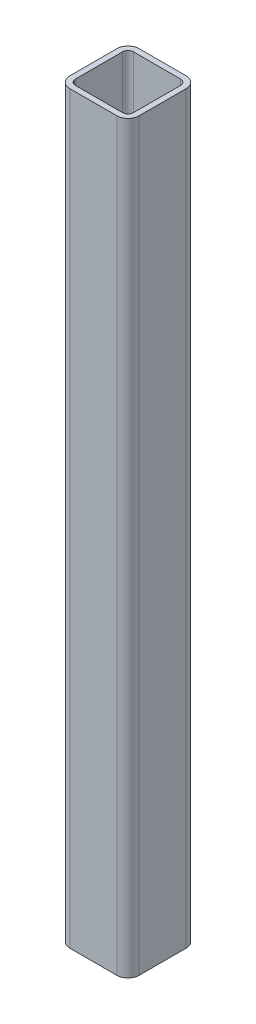
ISO-10303-21;
HEADER;
FILE_DESCRIPTION(('STEP AP214'),'2;1');
FILE_NAME('part.step','',(''),(''),'','','');
FILE_SCHEMA(('AUTOMOTIVE_DESIGN { 1 0 10303 214 1 1 1 1 }'));
ENDSEC;
DATA;
#1=APPLICATION_CONTEXT('core data for automotive mechanical design processes');
#2=APPLICATION_PROTOCOL_DEFINITION('international standard','automotive_design',2000,#1);
#3=PRODUCT_CONTEXT('',#1,'mechanical');
#4=PRODUCT('Part','Part','',(#3));
#5=PRODUCT_RELATED_PRODUCT_CATEGORY('part','',(#4));
#6=PRODUCT_DEFINITION_FORMATION('','',#4);
#7=PRODUCT_DEFINITION_CONTEXT('part definition',#1,'design');
#8=PRODUCT_DEFINITION('design','',#6,#7);
#9=PRODUCT_DEFINITION_SHAPE('','',#8);
#10=(LENGTH_UNIT() NAMED_UNIT(*) SI_UNIT(.MILLI.,.METRE.));
#11=(NAMED_UNIT(*) PLANE_ANGLE_UNIT() SI_UNIT($,.RADIAN.));
#12=(NAMED_UNIT(*) SI_UNIT($,.STERADIAN.) SOLID_ANGLE_UNIT());
#13=UNCERTAINTY_MEASURE_WITH_UNIT(LENGTH_MEASURE(1.E-05),#10,'distance_accuracy_value','');
#14=(GEOMETRIC_REPRESENTATION_CONTEXT(3) GLOBAL_UNCERTAINTY_ASSIGNED_CONTEXT((#13)) GLOBAL_UNIT_ASSIGNED_CONTEXT((#10,
#11,#12)) REPRESENTATION_CONTEXT('',''));
#15=CARTESIAN_POINT('',(0.,0.,0.));
#16=DIRECTION('',(0.,0.,1.));
#17=DIRECTION('',(1.,0.,0.));
#18=AXIS2_PLACEMENT_3D('',#15,#16,#17);
#19=CARTESIAN_POINT('',(1193.6,-1220.,76.3999999999998));
#20=DIRECTION('',(0.,1.,0.));
#21=DIRECTION('',(-1.,0.,0.));
#22=AXIS2_PLACEMENT_3D('',#19,#20,#21);
#23=CYLINDRICAL_SURFACE('',#22,6.39999999999996);
#24=CARTESIAN_POINT('',(1193.6,-770.,76.3999999999998));
#25=DIRECTION('',(0.,1.,0.));
#26=DIRECTION('',(-1.,0.,0.));
#27=AXIS2_PLACEMENT_3D('',#24,#25,#26);
#28=CIRCLE('',#27,6.39999999999996);
#29=CARTESIAN_POINT('',(1200.,-770.,76.3999999999998));
#30=VERTEX_POINT('',#29);
#31=CARTESIAN_POINT('',(1193.6,-770.,69.9999999999998));
#32=VERTEX_POINT('',#31);
#33=EDGE_CURVE('E22',#30,#32,#28,.T.);
#34=ORIENTED_EDGE('',*,*,#33,.F.);
#35=DIRECTION('',(0.,-1.,0.));
#36=VECTOR('',#35,1.);
#37=CARTESIAN_POINT('',(1200.,-1220.,76.3999999999999));
#38=LINE('',#37,#36);
#39=CARTESIAN_POINT('',(1200.,-1200.,76.3999999999998));
#40=VERTEX_POINT('',#39);
#41=EDGE_CURVE('E125',#30,#40,#38,.T.);
#42=ORIENTED_EDGE('',*,*,#41,.T.);
#43=CARTESIAN_POINT('',(1193.6,-1200.,76.3999999999998));
#44=DIRECTION('',(0.,1.,0.));
#45=DIRECTION('',(-1.,0.,0.));
#46=AXIS2_PLACEMENT_3D('',#43,#44,#45);
#47=CIRCLE('',#46,6.39999999999996);
#48=CARTESIAN_POINT('',(1193.6,-1200.,69.9999999999998));
#49=VERTEX_POINT('',#48);
#50=EDGE_CURVE('E141',#49,#40,#47,.F.);
#51=ORIENTED_EDGE('',*,*,#50,.F.);
#52=DIRECTION('',(0.,-1.,0.));
#53=VECTOR('',#52,1.);
#54=CARTESIAN_POINT('',(1193.6,-1220.,69.9999999999998));
#55=LINE('',#54,#53);
#56=EDGE_CURVE('E140',#49,#32,#55,.F.);
#57=ORIENTED_EDGE('',*,*,#56,.T.);
#58=EDGE_LOOP('',(#34,#42,#51,#57));
#59=FACE_BOUND('',#58,.T.);
#60=ADVANCED_FACE('F19',(#59),#23,.T.);
#61=CARTESIAN_POINT('',(1200.,-1220.,103.6));
#62=DIRECTION('',(-1.,0.,0.));
#63=DIRECTION('',(0.,-1.,0.));
#64=AXIS2_PLACEMENT_3D('',#61,#62,#63);
#65=PLANE('',#64);
#66=DIRECTION('',(0.,0.,-1.));
#67=VECTOR('',#66,1.);
#68=CARTESIAN_POINT('',(1200.,-1200.,-880.));
#69=LINE('',#68,#67);
#70=CARTESIAN_POINT('',(1200.,-1200.,103.6));
#71=VERTEX_POINT('',#70);
#72=EDGE_CURVE('E190',#40,#71,#69,.F.);
#73=ORIENTED_EDGE('',*,*,#72,.F.);
#74=ORIENTED_EDGE('',*,*,#41,.F.);
#75=DIRECTION('',(0.,0.,1.));
#76=VECTOR('',#75,1.);
#77=CARTESIAN_POINT('',(1200.,-770.,-880.));
#78=LINE('',#77,#76);
#79=CARTESIAN_POINT('',(1200.,-770.,103.6));
#80=VERTEX_POINT('',#79);
#81=EDGE_CURVE('E137',#80,#30,#78,.F.);
#82=ORIENTED_EDGE('',*,*,#81,.F.);
#83=DIRECTION('',(0.,1.,0.));
#84=VECTOR('',#83,1.);
#85=CARTESIAN_POINT('',(1200.,-1220.,103.6));
#86=LINE('',#85,#84);
#87=EDGE_CURVE('E204',#71,#80,#86,.T.);
#88=ORIENTED_EDGE('',*,*,#87,.F.);
#89=EDGE_LOOP('',(#73,#74,#82,#88));
#90=FACE_BOUND('',#89,.T.);
#91=ADVANCED_FACE('F303',(#90),#65,.F.);
#92=CARTESIAN_POINT('',(1166.4,-1220.,76.3999999999998));
#93=DIRECTION('',(0.,1.,0.));
#94=DIRECTION('',(-1.,0.,0.));
#95=AXIS2_PLACEMENT_3D('',#92,#93,#94);
#96=CYLINDRICAL_SURFACE('',#95,6.39999999999996);
#97=CARTESIAN_POINT('',(1166.4,-770.,76.3999999999998));
#98=DIRECTION('',(0.,1.,0.));
#99=DIRECTION('',(-1.,0.,0.));
#100=AXIS2_PLACEMENT_3D('',#97,#98,#99);
#101=CIRCLE('',#100,6.39999999999996);
#102=CARTESIAN_POINT('',(1166.4,-770.,69.9999999999998));
#103=VERTEX_POINT('',#102);
#104=CARTESIAN_POINT('',(1160.,-770.,76.3999999999998));
#105=VERTEX_POINT('',#104);
#106=EDGE_CURVE('E150',#103,#105,#101,.T.);
#107=ORIENTED_EDGE('',*,*,#106,.F.);
#108=DIRECTION('',(0.,-1.,0.));
#109=VECTOR('',#108,1.);
#110=CARTESIAN_POINT('',(1166.4,-1220.,69.9999999999998));
#111=LINE('',#110,#109);
#112=CARTESIAN_POINT('',(1166.4,-1200.,69.9999999999998));
#113=VERTEX_POINT('',#112);
#114=EDGE_CURVE('E146',#103,#113,#111,.T.);
#115=ORIENTED_EDGE('',*,*,#114,.T.);
#116=CARTESIAN_POINT('',(1166.4,-1200.,76.3999999999998));
#117=DIRECTION('',(0.,1.,0.));
#118=DIRECTION('',(-1.,0.,0.));
#119=AXIS2_PLACEMENT_3D('',#116,#117,#118);
#120=CIRCLE('',#119,6.39999999999996);
#121=CARTESIAN_POINT('',(1160.,-1200.,76.3999999999998));
#122=VERTEX_POINT('',#121);
#123=EDGE_CURVE('E185',#122,#113,#120,.F.);
#124=ORIENTED_EDGE('',*,*,#123,.F.);
#125=DIRECTION('',(0.,1.,0.));
#126=VECTOR('',#125,1.);
#127=CARTESIAN_POINT('',(1160.,-1220.,76.3999999999998));
#128=LINE('',#127,#126);
#129=EDGE_CURVE('E157',#122,#105,#128,.T.);
#130=ORIENTED_EDGE('',*,*,#129,.T.);
#131=EDGE_LOOP('',(#107,#115,#124,#130));
#132=FACE_BOUND('',#131,.T.);
#133=ADVANCED_FACE('F282',(#132),#96,.T.);
#134=CARTESIAN_POINT('',(1166.4,-1220.,69.9999999999998));
#135=DIRECTION('',(0.,0.,1.));
#136=DIRECTION('',(0.,-1.,0.));
#137=AXIS2_PLACEMENT_3D('',#134,#135,#136);
#138=PLANE('',#137);
#139=DIRECTION('',(1.,0.,0.));
#140=VECTOR('',#139,1.);
#141=CARTESIAN_POINT('',(1166.4,-1200.,69.9999999999998));
#142=LINE('',#141,#140);
#143=EDGE_CURVE('E187',#113,#49,#142,.T.);
#144=ORIENTED_EDGE('',*,*,#143,.F.);
#145=ORIENTED_EDGE('',*,*,#114,.F.);
#146=DIRECTION('',(1.,0.,0.));
#147=VECTOR('',#146,1.);
#148=CARTESIAN_POINT('',(1193.6,-770.,69.9999999999998));
#149=LINE('',#148,#147);
#150=EDGE_CURVE('E134',#32,#103,#149,.F.);
#151=ORIENTED_EDGE('',*,*,#150,.F.);
#152=ORIENTED_EDGE('',*,*,#56,.F.);
#153=EDGE_LOOP('',(#144,#145,#151,#152));
#154=FACE_BOUND('',#153,.T.);
#155=ADVANCED_FACE('F148',(#154),#138,.F.);
#156=CARTESIAN_POINT('',(1163.2,-1220.,76.3999999999998));
#157=DIRECTION('',(1.,0.,0.));
#158=DIRECTION('',(0.,1.,0.));
#159=AXIS2_PLACEMENT_3D('',#156,#157,#158);
#160=PLANE('',#159);
#161=DIRECTION('',(0.,1.,0.));
#162=VECTOR('',#161,1.);
#163=CARTESIAN_POINT('',(1163.2,-1220.,76.3999999999998));
#164=LINE('',#163,#162);
#165=CARTESIAN_POINT('',(1163.2,-1200.,76.3999999999998));
#166=VERTEX_POINT('',#165);
#167=CARTESIAN_POINT('',(1163.2,-770.,76.3999999999998));
#168=VERTEX_POINT('',#167);
#169=EDGE_CURVE('E165',#166,#168,#164,.T.);
#170=ORIENTED_EDGE('',*,*,#169,.T.);
#171=DIRECTION('',(0.,0.,1.));
#172=VECTOR('',#171,1.);
#173=CARTESIAN_POINT('',(1163.2,-770.,-880.));
#174=LINE('',#173,#172);
#175=CARTESIAN_POINT('',(1163.2,-770.,103.6));
#176=VERTEX_POINT('',#175);
#177=EDGE_CURVE('E238',#176,#168,#174,.F.);
#178=ORIENTED_EDGE('',*,*,#177,.F.);
#179=DIRECTION('',(0.,1.,0.));
#180=VECTOR('',#179,1.);
#181=CARTESIAN_POINT('',(1163.2,-1220.,103.6));
#182=LINE('',#181,#180);
#183=CARTESIAN_POINT('',(1163.2,-1200.,103.6));
#184=VERTEX_POINT('',#183);
#185=EDGE_CURVE('E145',#176,#184,#182,.F.);
#186=ORIENTED_EDGE('',*,*,#185,.T.);
#187=DIRECTION('',(0.,0.,-1.));
#188=VECTOR('',#187,1.);
#189=CARTESIAN_POINT('',(1163.2,-1200.,-880.));
#190=LINE('',#189,#188);
#191=EDGE_CURVE('E221',#166,#184,#190,.F.);
#192=ORIENTED_EDGE('',*,*,#191,.F.);
#193=EDGE_LOOP('',(#170,#178,#186,#192));
#194=FACE_BOUND('',#193,.T.);
#195=ADVANCED_FACE('F350',(#194),#160,.T.);
#196=CARTESIAN_POINT('',(1166.4,-1220.,103.6));
#197=DIRECTION('',(0.,1.,0.));
#198=DIRECTION('',(-1.,0.,0.));
#199=AXIS2_PLACEMENT_3D('',#196,#197,#198);
#200=CYLINDRICAL_SURFACE('',#199,3.19999999999987);
#201=DIRECTION('',(0.,1.,0.));
#202=VECTOR('',#201,1.);
#203=CARTESIAN_POINT('',(1166.4,-1220.,106.8));
#204=LINE('',#203,#202);
#205=CARTESIAN_POINT('',(1166.4,-1200.,106.8));
#206=VERTEX_POINT('',#205);
#207=CARTESIAN_POINT('',(1166.4,-770.,106.8));
#208=VERTEX_POINT('',#207);
#209=EDGE_CURVE('E268',#206,#208,#204,.T.);
#210=ORIENTED_EDGE('',*,*,#209,.F.);
#211=CARTESIAN_POINT('',(1166.4,-1200.,103.6));
#212=DIRECTION('',(0.,1.,0.));
#213=DIRECTION('',(-1.,0.,0.));
#214=AXIS2_PLACEMENT_3D('',#211,#212,#213);
#215=CIRCLE('',#214,3.19999999999987);
#216=EDGE_CURVE('E219',#184,#206,#215,.T.);
#217=ORIENTED_EDGE('',*,*,#216,.F.);
#218=ORIENTED_EDGE('',*,*,#185,.F.);
#219=CARTESIAN_POINT('',(1166.4,-770.,103.6));
#220=DIRECTION('',(0.,1.,0.));
#221=DIRECTION('',(-1.,0.,0.));
#222=AXIS2_PLACEMENT_3D('',#219,#220,#221);
#223=CIRCLE('',#222,3.19999999999987);
#224=EDGE_CURVE('E239',#208,#176,#223,.F.);
#225=ORIENTED_EDGE('',*,*,#224,.F.);
#226=EDGE_LOOP('',(#210,#217,#218,#225));
#227=FACE_BOUND('',#226,.T.);
#228=ADVANCED_FACE('F347',(#227),#200,.F.);
#229=CARTESIAN_POINT('',(1193.6,-1220.,106.8));
#230=DIRECTION('',(0.,0.,-1.));
#231=DIRECTION('',(0.,1.,0.));
#232=AXIS2_PLACEMENT_3D('',#229,#230,#231);
#233=PLANE('',#232);
#234=ORIENTED_EDGE('',*,*,#209,.T.);
#235=DIRECTION('',(1.,0.,0.));
#236=VECTOR('',#235,1.);
#237=CARTESIAN_POINT('',(1193.6,-770.,106.8));
#238=LINE('',#237,#236);
#239=CARTESIAN_POINT('',(1193.6,-770.,106.8));
#240=VERTEX_POINT('',#239);
#241=EDGE_CURVE('E241',#240,#208,#238,.F.);
#242=ORIENTED_EDGE('',*,*,#241,.F.);
#243=DIRECTION('',(0.,1.,0.));
#244=VECTOR('',#243,1.);
#245=CARTESIAN_POINT('',(1193.6,-1220.,106.8));
#246=LINE('',#245,#244);
#247=CARTESIAN_POINT('',(1193.6,-1200.,106.8));
#248=VERTEX_POINT('',#247);
#249=EDGE_CURVE('E265',#240,#248,#246,.F.);
#250=ORIENTED_EDGE('',*,*,#249,.T.);
#251=DIRECTION('',(1.,0.,0.));
#252=VECTOR('',#251,1.);
#253=CARTESIAN_POINT('',(1166.4,-1200.,106.8));
#254=LINE('',#253,#252);
#255=EDGE_CURVE('E218',#206,#248,#254,.T.);
#256=ORIENTED_EDGE('',*,*,#255,.F.);
#257=EDGE_LOOP('',(#234,#242,#250,#256));
#258=FACE_BOUND('',#257,.T.);
#259=ADVANCED_FACE('F344',(#258),#233,.T.);
#260=CARTESIAN_POINT('',(1193.6,-1220.,103.6));
#261=DIRECTION('',(0.,1.,0.));
#262=DIRECTION('',(-1.,0.,0.));
#263=AXIS2_PLACEMENT_3D('',#260,#261,#262);
#264=CYLINDRICAL_SURFACE('',#263,3.19999999999987);
#265=DIRECTION('',(0.,-1.,0.));
#266=VECTOR('',#265,1.);
#267=CARTESIAN_POINT('',(1196.8,-1220.,103.6));
#268=LINE('',#267,#266);
#269=CARTESIAN_POINT('',(1196.8,-1200.,103.6));
#270=VERTEX_POINT('',#269);
#271=CARTESIAN_POINT('',(1196.8,-770.,103.6));
#272=VERTEX_POINT('',#271);
#273=EDGE_CURVE('E262',#270,#272,#268,.F.);
#274=ORIENTED_EDGE('',*,*,#273,.F.);
#275=CARTESIAN_POINT('',(1193.6,-1200.,103.6));
#276=DIRECTION('',(0.,1.,0.));
#277=DIRECTION('',(-1.,0.,0.));
#278=AXIS2_PLACEMENT_3D('',#275,#276,#277);
#279=CIRCLE('',#278,3.19999999999987);
#280=EDGE_CURVE('E216',#248,#270,#279,.T.);
#281=ORIENTED_EDGE('',*,*,#280,.F.);
#282=ORIENTED_EDGE('',*,*,#249,.F.);
#283=CARTESIAN_POINT('',(1193.6,-770.,103.6));
#284=DIRECTION('',(0.,1.,0.));
#285=DIRECTION('',(-1.,0.,0.));
#286=AXIS2_PLACEMENT_3D('',#283,#284,#285);
#287=CIRCLE('',#286,3.19999999999987);
#288=EDGE_CURVE('E227',#272,#240,#287,.F.);
#289=ORIENTED_EDGE('',*,*,#288,.F.);
#290=EDGE_LOOP('',(#274,#281,#282,#289));
#291=FACE_BOUND('',#290,.T.);
#292=ADVANCED_FACE('F260',(#291),#264,.F.);
#293=CARTESIAN_POINT('',(1196.8,-1220.,103.6));
#294=DIRECTION('',(-1.,0.,0.));
#295=DIRECTION('',(0.,-1.,0.));
#296=AXIS2_PLACEMENT_3D('',#293,#294,#295);
#297=PLANE('',#296);
#298=ORIENTED_EDGE('',*,*,#273,.T.);
#299=DIRECTION('',(0.,0.,1.));
#300=VECTOR('',#299,1.);
#301=CARTESIAN_POINT('',(1196.8,-770.,-880.));
#302=LINE('',#301,#300);
#303=CARTESIAN_POINT('',(1196.8,-770.,76.3999999999998));
#304=VERTEX_POINT('',#303);
#305=EDGE_CURVE('E230',#304,#272,#302,.T.);
#306=ORIENTED_EDGE('',*,*,#305,.F.);
#307=DIRECTION('',(0.,1.,0.));
#308=VECTOR('',#307,1.);
#309=CARTESIAN_POINT('',(1196.8,-1220.,76.3999999999998));
#310=LINE('',#309,#308);
#311=CARTESIAN_POINT('',(1196.8,-1200.,76.3999999999998));
#312=VERTEX_POINT('',#311);
#313=EDGE_CURVE('E270',#304,#312,#310,.F.);
#314=ORIENTED_EDGE('',*,*,#313,.T.);
#315=DIRECTION('',(0.,0.,-1.));
#316=VECTOR('',#315,1.);
#317=CARTESIAN_POINT('',(1196.8,-1200.,-880.));
#318=LINE('',#317,#316);
#319=EDGE_CURVE('E215',#270,#312,#318,.T.);
#320=ORIENTED_EDGE('',*,*,#319,.F.);
#321=EDGE_LOOP('',(#298,#306,#314,#320));
#322=FACE_BOUND('',#321,.T.);
#323=ADVANCED_FACE('F338',(#322),#297,.T.);
#324=CARTESIAN_POINT('',(1193.6,-1220.,76.3999999999998));
#325=DIRECTION('',(0.,1.,0.));
#326=DIRECTION('',(-1.,0.,0.));
#327=AXIS2_PLACEMENT_3D('',#324,#325,#326);
#328=CYLINDRICAL_SURFACE('',#327,3.19999999999987);
#329=DIRECTION('',(0.,-1.,0.));
#330=VECTOR('',#329,1.);
#331=CARTESIAN_POINT('',(1193.6,-1220.,73.1999999999998));
#332=LINE('',#331,#330);
#333=CARTESIAN_POINT('',(1193.6,-1200.,73.1999999999998));
#334=VERTEX_POINT('',#333);
#335=CARTESIAN_POINT('',(1193.6,-770.,73.1999999999998));
#336=VERTEX_POINT('',#335);
#337=EDGE_CURVE('E166',#334,#336,#332,.F.);
#338=ORIENTED_EDGE('',*,*,#337,.F.);
#339=CARTESIAN_POINT('',(1193.6,-1200.,76.3999999999998));
#340=DIRECTION('',(0.,1.,0.));
#341=DIRECTION('',(-1.,0.,0.));
#342=AXIS2_PLACEMENT_3D('',#339,#340,#341);
#343=CIRCLE('',#342,3.19999999999987);
#344=EDGE_CURVE('E213',#312,#334,#343,.T.);
#345=ORIENTED_EDGE('',*,*,#344,.F.);
#346=ORIENTED_EDGE('',*,*,#313,.F.);
#347=CARTESIAN_POINT('',(1193.6,-770.,76.3999999999998));
#348=DIRECTION('',(0.,1.,0.));
#349=DIRECTION('',(-1.,0.,0.));
#350=AXIS2_PLACEMENT_3D('',#347,#348,#349);
#351=CIRCLE('',#350,3.19999999999987);
#352=EDGE_CURVE('E231',#336,#304,#351,.F.);
#353=ORIENTED_EDGE('',*,*,#352,.F.);
#354=EDGE_LOOP('',(#338,#345,#346,#353));
#355=FACE_BOUND('',#354,.T.);
#356=ADVANCED_FACE('F334',(#355),#328,.F.);
#357=CARTESIAN_POINT('',(1166.4,-1220.,73.1999999999998));
#358=DIRECTION('',(0.,0.,1.));
#359=DIRECTION('',(0.,-1.,0.));
#360=AXIS2_PLACEMENT_3D('',#357,#358,#359);
#361=PLANE('',#360);
#362=ORIENTED_EDGE('',*,*,#337,.T.);
#363=DIRECTION('',(1.,0.,0.));
#364=VECTOR('',#363,1.);
#365=CARTESIAN_POINT('',(1193.6,-770.,73.1999999999998));
#366=LINE('',#365,#364);
#367=CARTESIAN_POINT('',(1166.4,-770.,73.1999999999999));
#368=VERTEX_POINT('',#367);
#369=EDGE_CURVE('E234',#368,#336,#366,.T.);
#370=ORIENTED_EDGE('',*,*,#369,.F.);
#371=DIRECTION('',(0.,1.,0.));
#372=VECTOR('',#371,1.);
#373=CARTESIAN_POINT('',(1166.4,-1220.,73.1999999999999));
#374=LINE('',#373,#372);
#375=CARTESIAN_POINT('',(1166.4,-1200.,73.1999999999999));
#376=VERTEX_POINT('',#375);
#377=EDGE_CURVE('E162',#368,#376,#374,.F.);
#378=ORIENTED_EDGE('',*,*,#377,.T.);
#379=DIRECTION('',(1.,0.,0.));
#380=VECTOR('',#379,1.);
#381=CARTESIAN_POINT('',(1166.4,-1200.,73.1999999999998));
#382=LINE('',#381,#380);
#383=EDGE_CURVE('E212',#334,#376,#382,.F.);
#384=ORIENTED_EDGE('',*,*,#383,.F.);
#385=EDGE_LOOP('',(#362,#370,#378,#384));
#386=FACE_BOUND('',#385,.T.);
#387=ADVANCED_FACE('F330',(#386),#361,.T.);
#388=CARTESIAN_POINT('',(1166.4,-1220.,76.3999999999998));
#389=DIRECTION('',(0.,1.,0.));
#390=DIRECTION('',(-1.,0.,0.));
#391=AXIS2_PLACEMENT_3D('',#388,#389,#390);
#392=CYLINDRICAL_SURFACE('',#391,3.19999999999987);
#393=ORIENTED_EDGE('',*,*,#169,.F.);
#394=CARTESIAN_POINT('',(1166.4,-1200.,76.3999999999998));
#395=DIRECTION('',(0.,1.,0.));
#396=DIRECTION('',(-1.,0.,0.));
#397=AXIS2_PLACEMENT_3D('',#394,#395,#396);
#398=CIRCLE('',#397,3.19999999999987);
#399=EDGE_CURVE('E209',#376,#166,#398,.T.);
#400=ORIENTED_EDGE('',*,*,#399,.F.);
#401=ORIENTED_EDGE('',*,*,#377,.F.);
#402=CARTESIAN_POINT('',(1166.4,-770.,76.3999999999998));
#403=DIRECTION('',(0.,1.,0.));
#404=DIRECTION('',(-1.,0.,0.));
#405=AXIS2_PLACEMENT_3D('',#402,#403,#404);
#406=CIRCLE('',#405,3.19999999999987);
#407=EDGE_CURVE('E235',#168,#368,#406,.F.);
#408=ORIENTED_EDGE('',*,*,#407,.F.);
#409=EDGE_LOOP('',(#393,#400,#401,#408));
#410=FACE_BOUND('',#409,.T.);
#411=ADVANCED_FACE('F327',(#410),#392,.F.);
#412=CARTESIAN_POINT('',(1160.,-1220.,76.3999999999998));
#413=DIRECTION('',(1.,0.,0.));
#414=DIRECTION('',(0.,1.,0.));
#415=AXIS2_PLACEMENT_3D('',#412,#413,#414);
#416=PLANE('',#415);
#417=DIRECTION('',(0.,0.,-1.));
#418=VECTOR('',#417,1.);
#419=CARTESIAN_POINT('',(1160.,-1200.,-880.));
#420=LINE('',#419,#418);
#421=CARTESIAN_POINT('',(1160.,-1200.,103.6));
#422=VERTEX_POINT('',#421);
#423=EDGE_CURVE('E180',#422,#122,#420,.T.);
#424=ORIENTED_EDGE('',*,*,#423,.F.);
#425=DIRECTION('',(0.,1.,0.));
#426=VECTOR('',#425,1.);
#427=CARTESIAN_POINT('',(1160.,-1220.,103.6));
#428=LINE('',#427,#426);
#429=CARTESIAN_POINT('',(1160.,-770.,103.6));
#430=VERTEX_POINT('',#429);
#431=EDGE_CURVE('E158',#430,#422,#428,.F.);
#432=ORIENTED_EDGE('',*,*,#431,.F.);
#433=DIRECTION('',(0.,0.,1.));
#434=VECTOR('',#433,1.);
#435=CARTESIAN_POINT('',(1160.,-770.,-880.));
#436=LINE('',#435,#434);
#437=EDGE_CURVE('E152',#105,#430,#436,.T.);
#438=ORIENTED_EDGE('',*,*,#437,.F.);
#439=ORIENTED_EDGE('',*,*,#129,.F.);
#440=EDGE_LOOP('',(#424,#432,#438,#439));
#441=FACE_BOUND('',#440,.T.);
#442=ADVANCED_FACE('F286',(#441),#416,.F.);
#443=CARTESIAN_POINT('',(1193.6,-770.,-880.));
#444=DIRECTION('',(0.,1.,0.));
#445=DIRECTION('',(0.,0.,1.));
#446=AXIS2_PLACEMENT_3D('',#443,#444,#445);
#447=PLANE('',#446);
#448=ORIENTED_EDGE('',*,*,#305,.T.);
#449=ORIENTED_EDGE('',*,*,#288,.T.);
#450=ORIENTED_EDGE('',*,*,#241,.T.);
#451=ORIENTED_EDGE('',*,*,#224,.T.);
#452=ORIENTED_EDGE('',*,*,#177,.T.);
#453=ORIENTED_EDGE('',*,*,#407,.T.);
#454=ORIENTED_EDGE('',*,*,#369,.T.);
#455=ORIENTED_EDGE('',*,*,#352,.T.);
#456=EDGE_LOOP('',(#448,#449,#450,#451,#452,#453,#454,#455));
#457=FACE_BOUND('',#456,.T.);
#458=ORIENTED_EDGE('',*,*,#106,.T.);
#459=ORIENTED_EDGE('',*,*,#437,.T.);
#460=CARTESIAN_POINT('',(1166.4,-770.,103.6));
#461=DIRECTION('',(0.,1.,0.));
#462=DIRECTION('',(-1.,0.,0.));
#463=AXIS2_PLACEMENT_3D('',#460,#461,#462);
#464=CIRCLE('',#463,6.39999999999996);
#465=CARTESIAN_POINT('',(1166.4,-770.,110.));
#466=VERTEX_POINT('',#465);
#467=EDGE_CURVE('E161',#466,#430,#464,.F.);
#468=ORIENTED_EDGE('',*,*,#467,.F.);
#469=DIRECTION('',(1.,0.,0.));
#470=VECTOR('',#469,1.);
#471=CARTESIAN_POINT('',(1193.6,-770.,110.));
#472=LINE('',#471,#470);
#473=CARTESIAN_POINT('',(1193.6,-770.,110.));
#474=VERTEX_POINT('',#473);
#475=EDGE_CURVE('E160',#466,#474,#472,.T.);
#476=ORIENTED_EDGE('',*,*,#475,.T.);
#477=CARTESIAN_POINT('',(1193.6,-770.,103.6));
#478=DIRECTION('',(0.,1.,0.));
#479=DIRECTION('',(-1.,0.,0.));
#480=AXIS2_PLACEMENT_3D('',#477,#478,#479);
#481=CIRCLE('',#480,6.39999999999996);
#482=EDGE_CURVE('E225',#80,#474,#481,.F.);
#483=ORIENTED_EDGE('',*,*,#482,.F.);
#484=ORIENTED_EDGE('',*,*,#81,.T.);
#485=ORIENTED_EDGE('',*,*,#33,.T.);
#486=ORIENTED_EDGE('',*,*,#150,.T.);
#487=EDGE_LOOP('',(#458,#459,#468,#476,#483,#484,#485,#486));
#488=FACE_BOUND('',#487,.T.);
#489=ADVANCED_FACE('F132',(#457,#488),#447,.T.);
#490=CARTESIAN_POINT('',(1193.6,-1220.,103.6));
#491=DIRECTION('',(0.,1.,0.));
#492=DIRECTION('',(-1.,0.,0.));
#493=AXIS2_PLACEMENT_3D('',#490,#491,#492);
#494=CYLINDRICAL_SURFACE('',#493,6.39999999999996);
#495=ORIENTED_EDGE('',*,*,#482,.T.);
#496=DIRECTION('',(0.,1.,0.));
#497=VECTOR('',#496,1.);
#498=CARTESIAN_POINT('',(1193.6,-1220.,110.));
#499=LINE('',#498,#497);
#500=CARTESIAN_POINT('',(1193.6,-1200.,110.));
#501=VERTEX_POINT('',#500);
#502=EDGE_CURVE('E192',#474,#501,#499,.F.);
#503=ORIENTED_EDGE('',*,*,#502,.T.);
#504=CARTESIAN_POINT('',(1193.6,-1200.,103.6));
#505=DIRECTION('',(0.,1.,0.));
#506=DIRECTION('',(-1.,0.,0.));
#507=AXIS2_PLACEMENT_3D('',#504,#505,#506);
#508=CIRCLE('',#507,6.39999999999996);
#509=EDGE_CURVE('E186',#71,#501,#508,.F.);
#510=ORIENTED_EDGE('',*,*,#509,.F.);
#511=ORIENTED_EDGE('',*,*,#87,.T.);
#512=EDGE_LOOP('',(#495,#503,#510,#511));
#513=FACE_BOUND('',#512,.T.);
#514=ADVANCED_FACE('F302',(#513),#494,.T.);
#515=CARTESIAN_POINT('',(1166.4,-1200.,-880.));
#516=DIRECTION('',(0.,-1.,0.));
#517=DIRECTION('',(0.,0.,-1.));
#518=AXIS2_PLACEMENT_3D('',#515,#516,#517);
#519=PLANE('',#518);
#520=ORIENTED_EDGE('',*,*,#383,.T.);
#521=ORIENTED_EDGE('',*,*,#399,.T.);
#522=ORIENTED_EDGE('',*,*,#191,.T.);
#523=ORIENTED_EDGE('',*,*,#216,.T.);
#524=ORIENTED_EDGE('',*,*,#255,.T.);
#525=ORIENTED_EDGE('',*,*,#280,.T.);
#526=ORIENTED_EDGE('',*,*,#319,.T.);
#527=ORIENTED_EDGE('',*,*,#344,.T.);
#528=EDGE_LOOP('',(#520,#521,#522,#523,#524,#525,#526,#527));
#529=FACE_BOUND('',#528,.T.);
#530=ORIENTED_EDGE('',*,*,#123,.T.);
#531=ORIENTED_EDGE('',*,*,#143,.T.);
#532=ORIENTED_EDGE('',*,*,#50,.T.);
#533=ORIENTED_EDGE('',*,*,#72,.T.);
#534=ORIENTED_EDGE('',*,*,#509,.T.);
#535=DIRECTION('',(1.,0.,0.));
#536=VECTOR('',#535,1.);
#537=CARTESIAN_POINT('',(1193.6,-1200.,110.));
#538=LINE('',#537,#536);
#539=CARTESIAN_POINT('',(1166.4,-1200.,110.));
#540=VERTEX_POINT('',#539);
#541=EDGE_CURVE('E28',#501,#540,#538,.F.);
#542=ORIENTED_EDGE('',*,*,#541,.T.);
#543=CARTESIAN_POINT('',(1166.4,-1200.,103.6));
#544=DIRECTION('',(0.,1.,0.));
#545=DIRECTION('',(-1.,0.,0.));
#546=AXIS2_PLACEMENT_3D('',#543,#544,#545);
#547=CIRCLE('',#546,6.39999999999996);
#548=EDGE_CURVE('E36',#422,#540,#547,.T.);
#549=ORIENTED_EDGE('',*,*,#548,.F.);
#550=ORIENTED_EDGE('',*,*,#423,.T.);
#551=EDGE_LOOP('',(#530,#531,#532,#533,#534,#542,#549,#550));
#552=FACE_BOUND('',#551,.T.);
#553=ADVANCED_FACE('F298',(#529,#552),#519,.T.);
#554=CARTESIAN_POINT('',(1166.4,-1220.,103.6));
#555=DIRECTION('',(0.,1.,0.));
#556=DIRECTION('',(-1.,0.,0.));
#557=AXIS2_PLACEMENT_3D('',#554,#555,#556);
#558=CYLINDRICAL_SURFACE('',#557,6.39999999999996);
#559=ORIENTED_EDGE('',*,*,#467,.T.);
#560=ORIENTED_EDGE('',*,*,#431,.T.);
#561=ORIENTED_EDGE('',*,*,#548,.T.);
#562=DIRECTION('',(0.,1.,0.));
#563=VECTOR('',#562,1.);
#564=CARTESIAN_POINT('',(1166.4,-1220.,110.));
#565=LINE('',#564,#563);
#566=EDGE_CURVE('E12',#540,#466,#565,.T.);
#567=ORIENTED_EDGE('',*,*,#566,.T.);
#568=EDGE_LOOP('',(#559,#560,#561,#567));
#569=FACE_BOUND('',#568,.T.);
#570=ADVANCED_FACE('F290',(#569),#558,.T.);
#571=CARTESIAN_POINT('',(1193.6,-1220.,110.));
#572=DIRECTION('',(0.,0.,-1.));
#573=DIRECTION('',(0.,1.,0.));
#574=AXIS2_PLACEMENT_3D('',#571,#572,#573);
#575=PLANE('',#574);
#576=ORIENTED_EDGE('',*,*,#541,.F.);
#577=ORIENTED_EDGE('',*,*,#502,.F.);
#578=ORIENTED_EDGE('',*,*,#475,.F.);
#579=ORIENTED_EDGE('',*,*,#566,.F.);
#580=EDGE_LOOP('',(#576,#577,#578,#579));
#581=FACE_BOUND('',#580,.T.);
#582=ADVANCED_FACE('F295',(#581),#575,.F.);
#583=CLOSED_SHELL('',(#60,#91,#133,#155,#195,#228,#259,#292,#323,#356,#387,#411,#442,#489,#514,
#553,#570,#582));
#584=MANIFOLD_SOLID_BREP('B1',#583);
#585=ADVANCED_BREP_SHAPE_REPRESENTATION('',(#18,#584),#14);
#586=SHAPE_DEFINITION_REPRESENTATION(#9,#585);
ENDSEC;
END-ISO-10303-21;
